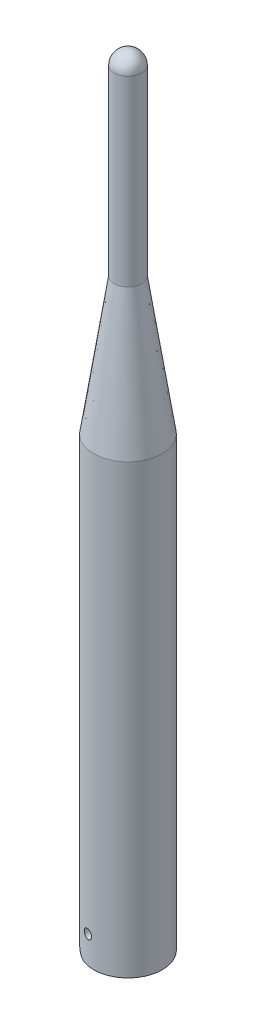
ISO-10303-21;
HEADER;
FILE_DESCRIPTION(('STEP AP214'),'2;1');
FILE_NAME('part.step','',(''),(''),'','','');
FILE_SCHEMA(('AUTOMOTIVE_DESIGN { 1 0 10303 214 1 1 1 1 }'));
ENDSEC;
DATA;
#1=APPLICATION_CONTEXT('core data for automotive mechanical design processes');
#2=APPLICATION_PROTOCOL_DEFINITION('international standard','automotive_design',2000,#1);
#3=PRODUCT_CONTEXT('',#1,'mechanical');
#4=PRODUCT('Part','Part','',(#3));
#5=PRODUCT_RELATED_PRODUCT_CATEGORY('part','',(#4));
#6=PRODUCT_DEFINITION_FORMATION('','',#4);
#7=PRODUCT_DEFINITION_CONTEXT('part definition',#1,'design');
#8=PRODUCT_DEFINITION('design','',#6,#7);
#9=PRODUCT_DEFINITION_SHAPE('','',#8);
#10=(LENGTH_UNIT() NAMED_UNIT(*) SI_UNIT(.MILLI.,.METRE.));
#11=(NAMED_UNIT(*) PLANE_ANGLE_UNIT() SI_UNIT($,.RADIAN.));
#12=(NAMED_UNIT(*) SI_UNIT($,.STERADIAN.) SOLID_ANGLE_UNIT());
#13=UNCERTAINTY_MEASURE_WITH_UNIT(LENGTH_MEASURE(1.E-05),#10,'distance_accuracy_value','');
#14=(GEOMETRIC_REPRESENTATION_CONTEXT(3) GLOBAL_UNCERTAINTY_ASSIGNED_CONTEXT((#13)) GLOBAL_UNIT_ASSIGNED_CONTEXT((#10,
#11,#12)) REPRESENTATION_CONTEXT('',''));
#15=CARTESIAN_POINT('',(0.,0.,0.));
#16=DIRECTION('',(0.,0.,1.));
#17=DIRECTION('',(1.,0.,0.));
#18=AXIS2_PLACEMENT_3D('',#15,#16,#17);
#19=CARTESIAN_POINT('',(0.,-78.,4.));
#20=DIRECTION('',(0.,0.,-1.));
#21=DIRECTION('',(-1.,0.,0.));
#22=AXIS2_PLACEMENT_3D('',#19,#20,#21);
#23=PLANE('',#22);
#24=CARTESIAN_POINT('',(-1.5,-84.,4.));
#25=DIRECTION('',(0.,0.,-1.));
#26=DIRECTION('',(-1.,0.,0.));
#27=AXIS2_PLACEMENT_3D('',#24,#25,#26);
#28=CIRCLE('',#27,1.);
#29=CARTESIAN_POINT('',(-2.5,-84.,4.));
#30=VERTEX_POINT('',#29);
#31=EDGE_CURVE('E231',#30,#30,#28,.T.);
#32=ORIENTED_EDGE('',*,*,#31,.F.);
#33=EDGE_LOOP('',(#32));
#34=FACE_BOUND('',#33,.T.);
#35=CARTESIAN_POINT('',(-2.34428877022476,-86.,4.));
#36=DIRECTION('',(0.,0.,-1.));
#37=DIRECTION('',(-1.,0.,0.));
#38=AXIS2_PLACEMENT_3D('',#35,#36,#37);
#39=CIRCLE('',#38,4.);
#40=CARTESIAN_POINT('',(-6.34428877022476,-86.,4.));
#41=VERTEX_POINT('',#40);
#42=CARTESIAN_POINT('',(-2.34428877022473,-90.,4.));
#43=VERTEX_POINT('',#42);
#44=EDGE_CURVE('E121',#41,#43,#39,.F.);
#45=ORIENTED_EDGE('',*,*,#44,.F.);
#46=DIRECTION('',(0.,-1.,0.));
#47=VECTOR('',#46,1.);
#48=CARTESIAN_POINT('',(-6.34428877022476,-78.,4.));
#49=LINE('',#48,#47);
#50=CARTESIAN_POINT('',(-6.34428877022476,-76.,4.));
#51=VERTEX_POINT('',#50);
#52=EDGE_CURVE('E142',#51,#41,#49,.T.);
#53=ORIENTED_EDGE('',*,*,#52,.F.);
#54=CARTESIAN_POINT('',(-6.34428877022476,-76.,4.));
#55=CARTESIAN_POINT('',(-6.24065150555362,-76.0876645844549,4.));
#56=CARTESIAN_POINT('',(-6.13671667269984,-76.1749762176017,4.));
#57=CARTESIAN_POINT('',(-5.9281671527139,-76.3487873336429,4.));
#58=CARTESIAN_POINT('',(-5.82355245324621,-76.4352868017314,4.));
#59=CARTESIAN_POINT('',(-5.50869527270602,-76.693297817078,4.));
#60=CARTESIAN_POINT('',(-5.29731343763854,-76.8634292191689,4.));
#61=CARTESIAN_POINT('',(-4.97728878333611,-77.1149331441965,4.));
#62=CARTESIAN_POINT('',(-4.87010542423131,-77.198164607321,4.));
#63=CARTESIAN_POINT('',(-4.65462354167118,-77.3631673822506,4.));
#64=CARTESIAN_POINT('',(-4.54632504907957,-77.4449387342971,4.));
#65=CARTESIAN_POINT('',(-4.32838915617984,-77.6068165324652,4.));
#66=CARTESIAN_POINT('',(-4.21875100971875,-77.6869219766989,4.));
#67=CARTESIAN_POINT('',(-3.99799219446533,-77.8450847860225,4.));
#68=CARTESIAN_POINT('',(-3.88687137881927,-77.9231419459305,4.));
#69=CARTESIAN_POINT('',(-3.77491721763538,-78.,4.));
#70=B_SPLINE_CURVE_WITH_KNOTS('',3,(#54,#55,#56,#57,#58,#59,#60,#61,#62,#63,#64,#65,#66,#67,#68,
#69),.UNSPECIFIED.,.F.,.F.,(4,2,2,2,2,2,2,4),(0.,0.407221710125804,0.814450829647081,
1.62841211679194,2.03551634676077,2.44260933936086,2.84994046604502,3.2573122415829),.UNSPECIFIED.);
#71=CARTESIAN_POINT('',(-3.77491721763538,-78.,4.));
#72=VERTEX_POINT('',#71);
#73=EDGE_CURVE('E61',#51,#72,#70,.T.);
#74=ORIENTED_EDGE('',*,*,#73,.T.);
#75=DIRECTION('',(1.,0.,0.));
#76=VECTOR('',#75,1.);
#77=CARTESIAN_POINT('',(0.,-78.,4.));
#78=LINE('',#77,#76);
#79=CARTESIAN_POINT('',(5.5,-78.,4.));
#80=VERTEX_POINT('',#79);
#81=EDGE_CURVE('E131',#72,#80,#78,.T.);
#82=ORIENTED_EDGE('',*,*,#81,.T.);
#83=DIRECTION('',(0.,-1.,0.));
#84=VECTOR('',#83,1.);
#85=CARTESIAN_POINT('',(5.5,-78.,4.));
#86=LINE('',#85,#84);
#87=CARTESIAN_POINT('',(5.5,-90.,4.));
#88=VERTEX_POINT('',#87);
#89=EDGE_CURVE('E133',#80,#88,#86,.T.);
#90=ORIENTED_EDGE('',*,*,#89,.T.);
#91=DIRECTION('',(1.,0.,0.));
#92=VECTOR('',#91,1.);
#93=CARTESIAN_POINT('',(0.,-90.,4.));
#94=LINE('',#93,#92);
#95=EDGE_CURVE('E236',#43,#88,#94,.T.);
#96=ORIENTED_EDGE('',*,*,#95,.F.);
#97=EDGE_LOOP('',(#45,#53,#74,#82,#90,#96));
#98=FACE_BOUND('',#97,.T.);
#99=ADVANCED_FACE('F46',(#34,#98),#23,.T.);
#100=CARTESIAN_POINT('',(0.,-78.,-4.));
#101=DIRECTION('',(0.,0.,-1.));
#102=DIRECTION('',(-1.,0.,0.));
#103=AXIS2_PLACEMENT_3D('',#100,#101,#102);
#104=PLANE('',#103);
#105=CARTESIAN_POINT('',(-1.5,-84.,-4.));
#106=DIRECTION('',(0.,0.,-1.));
#107=DIRECTION('',(-1.,0.,0.));
#108=AXIS2_PLACEMENT_3D('',#105,#106,#107);
#109=CIRCLE('',#108,1.);
#110=CARTESIAN_POINT('',(-2.5,-84.,-4.));
#111=VERTEX_POINT('',#110);
#112=EDGE_CURVE('E357',#111,#111,#109,.T.);
#113=ORIENTED_EDGE('',*,*,#112,.T.);
#114=EDGE_LOOP('',(#113));
#115=FACE_BOUND('',#114,.T.);
#116=DIRECTION('',(0.,-1.,0.));
#117=VECTOR('',#116,1.);
#118=CARTESIAN_POINT('',(-6.34428877022476,-78.,-4.));
#119=LINE('',#118,#117);
#120=CARTESIAN_POINT('',(-6.34428877022476,-76.,-4.));
#121=VERTEX_POINT('',#120);
#122=CARTESIAN_POINT('',(-6.34428877022476,-86.,-4.));
#123=VERTEX_POINT('',#122);
#124=EDGE_CURVE('E119',#121,#123,#119,.T.);
#125=ORIENTED_EDGE('',*,*,#124,.T.);
#126=CARTESIAN_POINT('',(-2.34428877022476,-86.,-4.));
#127=DIRECTION('',(0.,0.,-1.));
#128=DIRECTION('',(-1.,0.,0.));
#129=AXIS2_PLACEMENT_3D('',#126,#127,#128);
#130=CIRCLE('',#129,4.);
#131=CARTESIAN_POINT('',(-2.34428877022476,-90.,-4.));
#132=VERTEX_POINT('',#131);
#133=EDGE_CURVE('E12',#123,#132,#130,.F.);
#134=ORIENTED_EDGE('',*,*,#133,.T.);
#135=DIRECTION('',(1.,0.,0.));
#136=VECTOR('',#135,1.);
#137=CARTESIAN_POINT('',(0.,-90.,-4.));
#138=LINE('',#137,#136);
#139=CARTESIAN_POINT('',(5.5,-90.,-4.));
#140=VERTEX_POINT('',#139);
#141=EDGE_CURVE('E249',#132,#140,#138,.T.);
#142=ORIENTED_EDGE('',*,*,#141,.T.);
#143=DIRECTION('',(0.,-1.,0.));
#144=VECTOR('',#143,1.);
#145=CARTESIAN_POINT('',(5.5,-78.,-4.));
#146=LINE('',#145,#144);
#147=CARTESIAN_POINT('',(5.5,-78.,-4.));
#148=VERTEX_POINT('',#147);
#149=EDGE_CURVE('E128',#148,#140,#146,.T.);
#150=ORIENTED_EDGE('',*,*,#149,.F.);
#151=DIRECTION('',(1.,0.,0.));
#152=VECTOR('',#151,1.);
#153=CARTESIAN_POINT('',(0.,-78.,-4.));
#154=LINE('',#153,#152);
#155=CARTESIAN_POINT('',(-3.77491721763538,-78.,-4.));
#156=VERTEX_POINT('',#155);
#157=EDGE_CURVE('E243',#156,#148,#154,.T.);
#158=ORIENTED_EDGE('',*,*,#157,.F.);
#159=CARTESIAN_POINT('',(-3.77491721763538,-78.,-4.));
#160=CARTESIAN_POINT('',(-3.88687137881927,-77.9231419459305,-4.));
#161=CARTESIAN_POINT('',(-3.99799219446533,-77.8450847860225,-4.));
#162=CARTESIAN_POINT('',(-4.21875100971875,-77.6869219766989,-4.));
#163=CARTESIAN_POINT('',(-4.32838915617983,-77.6068165324652,-4.));
#164=CARTESIAN_POINT('',(-4.54632504907957,-77.4449387342971,-4.));
#165=CARTESIAN_POINT('',(-4.65462354167117,-77.3631673822506,-4.));
#166=CARTESIAN_POINT('',(-4.87010542423131,-77.198164607321,-4.));
#167=CARTESIAN_POINT('',(-4.97728878333611,-77.1149331441965,-4.));
#168=CARTESIAN_POINT('',(-5.29731343763854,-76.8634292191689,-4.));
#169=CARTESIAN_POINT('',(-5.50869527270602,-76.693297817078,-4.));
#170=CARTESIAN_POINT('',(-5.82355245324621,-76.4352868017314,-4.));
#171=CARTESIAN_POINT('',(-5.9281671527139,-76.3487873336429,-4.));
#172=CARTESIAN_POINT('',(-6.13671667269984,-76.1749762176017,-4.));
#173=CARTESIAN_POINT('',(-6.24065150555362,-76.0876645844549,-4.));
#174=CARTESIAN_POINT('',(-6.34428877022476,-76.,-4.));
#175=B_SPLINE_CURVE_WITH_KNOTS('',3,(#159,#160,#161,#162,#163,#164,#165,#166,#167,#168,#169,
#170,#171,#172,#173,#174),.UNSPECIFIED.,.F.,.F.,(4,2,2,2,2,2,2,4),(0.,0.407371775537878,
0.814702902222035,1.22179589482213,1.62890012479095,2.44286141193582,2.85009053145709,
3.2573122415829),.UNSPECIFIED.);
#176=EDGE_CURVE('E126',#156,#121,#175,.T.);
#177=ORIENTED_EDGE('',*,*,#176,.T.);
#178=EDGE_LOOP('',(#125,#134,#142,#150,#158,#177));
#179=FACE_BOUND('',#178,.T.);
#180=ADVANCED_FACE('F127',(#115,#179),#104,.F.);
#181=CARTESIAN_POINT('',(0.,81.,0.));
#182=DIRECTION('',(0.,1.,0.));
#183=DIRECTION('',(0.,0.,1.));
#184=AXIS2_PLACEMENT_3D('',#181,#182,#183);
#185=CYLINDRICAL_SURFACE('',#184,7.5);
#186=CARTESIAN_POINT('',(-0.499999999999999,-84.,-7.48331477354788));
#187=CARTESIAN_POINT('',(-0.500002294224662,-83.943974063396,-7.48331514734014));
#188=CARTESIAN_POINT('',(-0.504723612763676,-83.8879139604422,-7.48300379388825));
#189=CARTESIAN_POINT('',(-0.523488515347612,-83.7773434556476,-7.48171403967897));
#190=CARTESIAN_POINT('',(-0.537541588220618,-83.7228346901519,-7.48073495992855));
#191=CARTESIAN_POINT('',(-0.574564104874707,-83.616972090195,-7.47798226210355));
#192=CARTESIAN_POINT('',(-0.597530377165905,-83.5656171410642,-7.4762089266061));
#193=CARTESIAN_POINT('',(-0.651705465463514,-83.4675194428975,-7.47168088473047));
#194=CARTESIAN_POINT('',(-0.682912450638484,-83.4207756725648,-7.46892639628676));
#195=CARTESIAN_POINT('',(-0.752621672183066,-83.3332522082001,-7.46222365284704));
#196=CARTESIAN_POINT('',(-0.791117520739759,-83.2924673469361,-7.45827644133795));
#197=CARTESIAN_POINT('',(-0.874278680638487,-83.2179579819895,-7.44898539631068));
#198=CARTESIAN_POINT('',(-0.918944034346798,-83.184233526795,-7.44364155320154));
#199=CARTESIAN_POINT('',(-1.01309914144711,-83.1247702515083,-7.43141169607075));
#200=CARTESIAN_POINT('',(-1.06258772275765,-83.0990294976425,-7.42452605619251));
#201=CARTESIAN_POINT('',(-1.16493303721383,-83.0561735423196,-7.40915694111749));
#202=CARTESIAN_POINT('',(-1.21778983658044,-83.0390585105077,-7.40067343449938));
#203=CARTESIAN_POINT('',(-1.32577369444304,-83.0137214336976,-7.38209642520555));
#204=CARTESIAN_POINT('',(-1.38091548188131,-83.0055713047535,-7.371990637499));
#205=CARTESIAN_POINT('',(-1.49151958692298,-82.9985010440972,-7.35041123093763));
#206=CARTESIAN_POINT('',(-1.54698193891618,-82.9995819217583,-7.33893746263492));
#207=CARTESIAN_POINT('',(-1.65791439360795,-83.010941043508,-7.31468464658794));
#208=CARTESIAN_POINT('',(-1.71335951834747,-83.0214146246831,-7.30188300874597));
#209=CARTESIAN_POINT('',(-1.82157464799653,-83.0514513794144,-7.27564217356194));
#210=CARTESIAN_POINT('',(-1.87434419565762,-83.0710161008521,-7.26220286799891));
#211=CARTESIAN_POINT('',(-1.97709846425436,-83.1192747325111,-7.2349137814882));
#212=CARTESIAN_POINT('',(-2.02698324973639,-83.1481806132362,-7.22106201232799));
#213=CARTESIAN_POINT('',(-2.1211709088456,-83.2142168622807,-7.1939585245136));
#214=CARTESIAN_POINT('',(-2.16547326188895,-83.2513479967483,-7.18070686189543));
#215=CARTESIAN_POINT('',(-2.24730153271283,-83.3330011312151,-7.15552062770088));
#216=CARTESIAN_POINT('',(-2.28481332902545,-83.3775381717944,-7.14358882044391));
#217=CARTESIAN_POINT('',(-2.35172971420763,-83.4727980213948,-7.12184032166485));
#218=CARTESIAN_POINT('',(-2.38113618230035,-83.5235193926365,-7.11202313998164));
#219=CARTESIAN_POINT('',(-2.42985180931386,-83.6277597330563,-7.09552398119711));
#220=CARTESIAN_POINT('',(-2.44949224507349,-83.6811074571922,-7.08874006959283));
#221=CARTESIAN_POINT('',(-2.47948447368391,-83.7906418250084,-7.07830579464311));
#222=CARTESIAN_POINT('',(-2.48983981854332,-83.8468273743832,-7.07465423304133));
#223=CARTESIAN_POINT('',(-2.5005528195353,-83.9573526851148,-7.07087444193144));
#224=CARTESIAN_POINT('',(-2.50139394398307,-84.0116402167042,-7.07057583679983));
#225=CARTESIAN_POINT('',(-2.49429800495519,-84.1195605651142,-7.07308217538169));
#226=CARTESIAN_POINT('',(-2.48636197868213,-84.1731934585369,-7.07588675238977));
#227=CARTESIAN_POINT('',(-2.46223632051021,-84.2773234927333,-7.08431716674393));
#228=CARTESIAN_POINT('',(-2.44619453956458,-84.3278592283149,-7.08989243693944));
#229=CARTESIAN_POINT('',(-2.40649601589661,-84.4254917562853,-7.10346496629705));
#230=CARTESIAN_POINT('',(-2.38283827815411,-84.4725880983324,-7.11146254192382));
#231=CARTESIAN_POINT('',(-2.32779283203771,-84.5636280464157,-7.1296734784892));
#232=CARTESIAN_POINT('',(-2.29618640347721,-84.6074268814402,-7.13994834446277));
#233=CARTESIAN_POINT('',(-2.22657618206973,-84.6891818139507,-7.16196126909824));
#234=CARTESIAN_POINT('',(-2.18857078002029,-84.7271364371366,-7.17369969562059));
#235=CARTESIAN_POINT('',(-2.10507636140074,-84.7981452996081,-7.19865566123978));
#236=CARTESIAN_POINT('',(-2.05930505740825,-84.8308521729748,-7.21191806224143));
#237=CARTESIAN_POINT('',(-1.96299736756691,-84.8881294302874,-7.23872494081384));
#238=CARTESIAN_POINT('',(-1.91246007877278,-84.9126982684376,-7.25226947145556));
#239=CARTESIAN_POINT('',(-1.80635033103441,-84.9536656577316,-7.27943557218279));
#240=CARTESIAN_POINT('',(-1.7506727910942,-84.9697993345,-7.29304744163918));
#241=CARTESIAN_POINT('',(-1.63716023923553,-84.9922367356769,-7.3193646576276));
#242=CARTESIAN_POINT('',(-1.57932527735684,-84.9985406879334,-7.33207002516537));
#243=CARTESIAN_POINT('',(-1.46356774886237,-85.0009993509964,-7.35604769687094));
#244=CARTESIAN_POINT('',(-1.40564874128438,-84.9972260421708,-7.36732956500713));
#245=CARTESIAN_POINT('',(-1.29105326612441,-84.9796427769911,-7.38827270272527));
#246=CARTESIAN_POINT('',(-1.23437661461863,-84.9658343167645,-7.39793421361991));
#247=CARTESIAN_POINT('',(-1.1254615946641,-84.9289466959068,-7.41527494140721));
#248=CARTESIAN_POINT('',(-1.07314668498097,-84.9061143362036,-7.42299863607897));
#249=CARTESIAN_POINT('',(-0.972999787318483,-84.8517717374686,-7.43678886629274));
#250=CARTESIAN_POINT('',(-0.925167177979965,-84.8202627036334,-7.44285563175056));
#251=CARTESIAN_POINT('',(-0.836330861959564,-84.7501238855699,-7.45335614197829));
#252=CARTESIAN_POINT('',(-0.795214717578049,-84.711640697535,-7.45781871175929));
#253=CARTESIAN_POINT('',(-0.719959096940996,-84.628244073164,-7.46546002697499));
#254=CARTESIAN_POINT('',(-0.685820849902325,-84.5833295062506,-7.46863854630925));
#255=CARTESIAN_POINT('',(-0.625699846256159,-84.4886022557267,-7.47391523324346));
#256=CARTESIAN_POINT('',(-0.59967754731212,-84.4388149245537,-7.476018671928));
#257=CARTESIAN_POINT('',(-0.556337240213471,-84.3356000452033,-7.47936931450389));
#258=CARTESIAN_POINT('',(-0.539010444509423,-84.2821762342747,-7.48061738328809));
#259=CARTESIAN_POINT('',(-0.51754921297533,-84.1904208270863,-7.48212639728917));
#260=CARTESIAN_POINT('',(-0.510977518469956,-84.1526436676775,-7.48257452771826));
#261=CARTESIAN_POINT('',(-0.502202122993188,-84.0765829950463,-7.4831685884184));
#262=CARTESIAN_POINT('',(-0.499998431661859,-84.0382994807066,-7.48331451802249));
#263=CARTESIAN_POINT('',(-0.499999999999999,-84.,-7.48331477354788));
#264=B_SPLINE_CURVE_WITH_KNOTS('',3,(#186,#187,#188,#189,#190,#191,#192,#193,#194,#195,#196,
#197,#198,#199,#200,#201,#202,#203,#204,#205,#206,#207,#208,#209,#210,#211,#212,#213,#214,#215,
#216,#217,#218,#219,#220,#221,#222,#223,#224,#225,#226,#227,#228,#229,#230,#231,#232,#233,#234,
#235,#236,#237,#238,#239,#240,#241,#242,#243,#244,#245,#246,#247,#248,#249,#250,#251,#252,#253,
#254,#255,#256,#257,#258,#259,#260,#261,#262,#263),.UNSPECIFIED.,.T.,.F.,(4,2,2,2,2,2,2,2,2,2,2,
2,2,2,2,2,2,2,2,2,2,2,2,2,2,2,2,2,2,2,2,2,2,2,2,2,2,2,4),(0.,0.167938950192115,
0.336048928140746,0.50409914404694,0.67211205576056,0.839978400217488,1.0078458974777,
1.17567270287568,1.34350280885721,1.51266963796918,1.68185496502762,1.85464252646129,
2.02745951794711,2.20451156432329,2.38158010930058,2.55901275415276,2.73640422651463,
2.90727843984469,3.07808725737471,3.24017488251015,3.4022433556736,3.56145696923308,
3.72069139240253,3.88490856253923,4.04916709156871,4.22177894068744,4.39442355813834,
4.5722054889428,4.74998329879059,4.92649467066286,5.10297973208352,5.27493932115411,
5.44687503694236,5.61554547948254,5.7842456092188,5.95211047626055,6.11980535816171,
6.23460862210496,6.34941213941566),.UNSPECIFIED.);
#265=CARTESIAN_POINT('',(-0.499999999999999,-84.,-7.48331477354788));
#266=VERTEX_POINT('',#265);
#267=EDGE_CURVE('E55',#266,#266,#264,.T.);
#268=ORIENTED_EDGE('',*,*,#267,.T.);
#269=EDGE_LOOP('',(#268));
#270=FACE_BOUND('',#269,.T.);
#271=CARTESIAN_POINT('',(-0.499999999999999,-84.,7.48331477354788));
#272=CARTESIAN_POINT('',(-0.500002294224662,-84.056025936604,7.48331514734014));
#273=CARTESIAN_POINT('',(-0.504723612763676,-84.1120860395578,7.48300379388825));
#274=CARTESIAN_POINT('',(-0.523488515347612,-84.2226565443524,7.48171403967897));
#275=CARTESIAN_POINT('',(-0.537541588220618,-84.2771653098481,7.48073495992855));
#276=CARTESIAN_POINT('',(-0.574564104874705,-84.383027909805,7.47798226210355));
#277=CARTESIAN_POINT('',(-0.5975303771659,-84.4343828589358,7.4762089266061));
#278=CARTESIAN_POINT('',(-0.651705465463506,-84.5324805571025,7.47168088473047));
#279=CARTESIAN_POINT('',(-0.68291245063848,-84.5792243274352,7.46892639628676));
#280=CARTESIAN_POINT('',(-0.752621672183064,-84.6667477917999,7.46222365284704));
#281=CARTESIAN_POINT('',(-0.791117520739754,-84.7075326530639,7.45827644133795));
#282=CARTESIAN_POINT('',(-0.874278680638481,-84.7820420180105,7.44898539631068));
#283=CARTESIAN_POINT('',(-0.918944034346796,-84.815766473205,7.44364155320154));
#284=CARTESIAN_POINT('',(-1.01309914144711,-84.8752297484917,7.43141169607075));
#285=CARTESIAN_POINT('',(-1.06258772275765,-84.9009705023575,7.42452605619251));
#286=CARTESIAN_POINT('',(-1.16493303721383,-84.9438264576804,7.40915694111749));
#287=CARTESIAN_POINT('',(-1.21778983658044,-84.9609414894923,7.40067343449938));
#288=CARTESIAN_POINT('',(-1.32577369444304,-84.9862785663024,7.38209642520555));
#289=CARTESIAN_POINT('',(-1.38091548188131,-84.9944286952465,7.371990637499));
#290=CARTESIAN_POINT('',(-1.49151958692298,-85.0014989559028,7.35041123093763));
#291=CARTESIAN_POINT('',(-1.54698193891618,-85.0004180782417,7.33893746263492));
#292=CARTESIAN_POINT('',(-1.65791439360795,-84.989058956492,7.31468464658794));
#293=CARTESIAN_POINT('',(-1.71335951834747,-84.9785853753169,7.30188300874597));
#294=CARTESIAN_POINT('',(-1.82157464799653,-84.9485486205856,7.27564217356194));
#295=CARTESIAN_POINT('',(-1.87434419565762,-84.9289838991479,7.26220286799891));
#296=CARTESIAN_POINT('',(-1.97709846425436,-84.8807252674889,7.2349137814882));
#297=CARTESIAN_POINT('',(-2.02698324973639,-84.8518193867638,7.22106201232799));
#298=CARTESIAN_POINT('',(-2.1211709088456,-84.7857831377193,7.1939585245136));
#299=CARTESIAN_POINT('',(-2.16547326188895,-84.7486520032517,7.18070686189543));
#300=CARTESIAN_POINT('',(-2.24730153271283,-84.6669988687849,7.15552062770088));
#301=CARTESIAN_POINT('',(-2.28481332902545,-84.6224618282056,7.14358882044391));
#302=CARTESIAN_POINT('',(-2.35172971420763,-84.5272019786052,7.12184032166485));
#303=CARTESIAN_POINT('',(-2.38113618230035,-84.4764806073635,7.11202313998164));
#304=CARTESIAN_POINT('',(-2.42985180931386,-84.3722402669437,7.09552398119711));
#305=CARTESIAN_POINT('',(-2.44949224507349,-84.3188925428078,7.08874006959283));
#306=CARTESIAN_POINT('',(-2.47948447368391,-84.2093581749916,7.07830579464311));
#307=CARTESIAN_POINT('',(-2.48983981854332,-84.1531726256168,7.07465423304133));
#308=CARTESIAN_POINT('',(-2.5005528195353,-84.0426473148852,7.07087444193144));
#309=CARTESIAN_POINT('',(-2.50139394398307,-83.9883597832958,7.07057583679983));
#310=CARTESIAN_POINT('',(-2.49429800495519,-83.8804394348858,7.07308217538169));
#311=CARTESIAN_POINT('',(-2.48636197868213,-83.8268065414631,7.07588675238977));
#312=CARTESIAN_POINT('',(-2.46223632051021,-83.7226765072667,7.08431716674393));
#313=CARTESIAN_POINT('',(-2.44619453956458,-83.6721407716851,7.08989243693944));
#314=CARTESIAN_POINT('',(-2.40649601589661,-83.5745082437147,7.10346496629705));
#315=CARTESIAN_POINT('',(-2.38283827815411,-83.5274119016676,7.11146254192382));
#316=CARTESIAN_POINT('',(-2.32779283203771,-83.4363719535843,7.1296734784892));
#317=CARTESIAN_POINT('',(-2.29618640347721,-83.3925731185598,7.13994834446277));
#318=CARTESIAN_POINT('',(-2.22657618206973,-83.3108181860493,7.16196126909824));
#319=CARTESIAN_POINT('',(-2.18857078002029,-83.2728635628634,7.17369969562059));
#320=CARTESIAN_POINT('',(-2.10507636140074,-83.2018547003919,7.19865566123978));
#321=CARTESIAN_POINT('',(-2.05930505740825,-83.1691478270252,7.21191806224143));
#322=CARTESIAN_POINT('',(-1.96299736756691,-83.1118705697126,7.23872494081384));
#323=CARTESIAN_POINT('',(-1.91246007877278,-83.0873017315624,7.25226947145556));
#324=CARTESIAN_POINT('',(-1.80635033103441,-83.0463343422684,7.27943557218279));
#325=CARTESIAN_POINT('',(-1.7506727910942,-83.0302006655,7.29304744163918));
#326=CARTESIAN_POINT('',(-1.63716023923553,-83.0077632643231,7.3193646576276));
#327=CARTESIAN_POINT('',(-1.57932527735684,-83.0014593120666,7.33207002516537));
#328=CARTESIAN_POINT('',(-1.46356774886237,-82.9990006490036,7.35604769687094));
#329=CARTESIAN_POINT('',(-1.40564874128438,-83.0027739578292,7.36732956500713));
#330=CARTESIAN_POINT('',(-1.29105326612441,-83.0203572230089,7.38827270272527));
#331=CARTESIAN_POINT('',(-1.23437661461863,-83.0341656832355,7.39793421361991));
#332=CARTESIAN_POINT('',(-1.1254615946641,-83.0710533040932,7.41527494140721));
#333=CARTESIAN_POINT('',(-1.07314668498097,-83.0938856637964,7.42299863607897));
#334=CARTESIAN_POINT('',(-0.972999787318479,-83.1482282625315,7.43678886629274));
#335=CARTESIAN_POINT('',(-0.925167177979963,-83.1797372963666,7.44285563175056));
#336=CARTESIAN_POINT('',(-0.836330861959562,-83.2498761144301,7.45335614197829));
#337=CARTESIAN_POINT('',(-0.795214717578045,-83.288359302465,7.45781871175929));
#338=CARTESIAN_POINT('',(-0.719959096940993,-83.3717559268361,7.46546002697499));
#339=CARTESIAN_POINT('',(-0.685820849902323,-83.4166704937494,7.46863854630925));
#340=CARTESIAN_POINT('',(-0.625699846256159,-83.5113977442733,7.47391523324346));
#341=CARTESIAN_POINT('',(-0.59967754731212,-83.5611850754463,7.476018671928));
#342=CARTESIAN_POINT('',(-0.556337240213471,-83.6643999547967,7.47936931450389));
#343=CARTESIAN_POINT('',(-0.539010444509423,-83.7178237657253,7.48061738328809));
#344=CARTESIAN_POINT('',(-0.51754921297533,-83.8095791729137,7.48212639728917));
#345=CARTESIAN_POINT('',(-0.510977518469956,-83.8473563323225,7.48257452771826));
#346=CARTESIAN_POINT('',(-0.502202122993188,-83.9234170049537,7.4831685884184));
#347=CARTESIAN_POINT('',(-0.499998431661859,-83.9617005192934,7.48331451802249));
#348=CARTESIAN_POINT('',(-0.499999999999999,-84.,7.48331477354788));
#349=B_SPLINE_CURVE_WITH_KNOTS('',3,(#271,#272,#273,#274,#275,#276,#277,#278,#279,#280,#281,
#282,#283,#284,#285,#286,#287,#288,#289,#290,#291,#292,#293,#294,#295,#296,#297,#298,#299,#300,
#301,#302,#303,#304,#305,#306,#307,#308,#309,#310,#311,#312,#313,#314,#315,#316,#317,#318,#319,
#320,#321,#322,#323,#324,#325,#326,#327,#328,#329,#330,#331,#332,#333,#334,#335,#336,#337,#338,
#339,#340,#341,#342,#343,#344,#345,#346,#347,#348),.UNSPECIFIED.,.T.,.F.,(4,2,2,2,2,2,2,2,2,2,2,
2,2,2,2,2,2,2,2,2,2,2,2,2,2,2,2,2,2,2,2,2,2,2,2,2,2,2,4),(0.,0.167938950192115,
0.336048928140746,0.50409914404691,0.672112055760559,0.839978400217483,1.0078458974777,
1.17567270287568,1.34350280885721,1.51266963796918,1.68185496502762,1.85464252646129,
2.02745951794711,2.20451156432329,2.38158010930058,2.55901275415276,2.73640422651463,
2.90727843984469,3.07808725737471,3.24017488251015,3.4022433556736,3.56145696923308,
3.72069139240253,3.88490856253924,4.04916709156871,4.22177894068744,4.39442355813834,
4.5722054889428,4.74998329879059,4.92649467066286,5.10297973208352,5.27493932115412,
5.44687503694236,5.61554547948256,5.7842456092188,5.95211047626054,6.11980535816171,
6.23460862210496,6.34941213941565),.UNSPECIFIED.);
#350=CARTESIAN_POINT('',(-0.499999999999999,-84.,7.48331477354788));
#351=VERTEX_POINT('',#350);
#352=EDGE_CURVE('E210',#351,#351,#349,.T.);
#353=ORIENTED_EDGE('',*,*,#352,.T.);
#354=EDGE_LOOP('',(#353));
#355=FACE_BOUND('',#354,.T.);
#356=CARTESIAN_POINT('',(0.,-90.,0.));
#357=DIRECTION('',(0.,-1.,0.));
#358=DIRECTION('',(0.,0.,-1.));
#359=AXIS2_PLACEMENT_3D('',#356,#357,#358);
#360=CIRCLE('',#359,7.5);
#361=CARTESIAN_POINT('',(-2.34428877022473,-90.,-7.12420593201784));
#362=VERTEX_POINT('',#361);
#363=CARTESIAN_POINT('',(-2.34428877022473,-90.,7.12420593201784));
#364=VERTEX_POINT('',#363);
#365=EDGE_CURVE('E124',#362,#364,#360,.T.);
#366=ORIENTED_EDGE('',*,*,#365,.F.);
#367=CARTESIAN_POINT('',(-2.34428877022473,-90.,-7.12420593201784));
#368=CARTESIAN_POINT('',(-2.46106759006975,-90.0000146348701,-7.08580609904446));
#369=CARTESIAN_POINT('',(-2.5768312891128,-89.9948876868402,-7.04450479145868));
#370=CARTESIAN_POINT('',(-2.80535350297101,-89.9749874116234,-6.9566411303202));
#371=CARTESIAN_POINT('',(-2.91811530862086,-89.9602251421411,-6.91008485807216));
#372=CARTESIAN_POINT('',(-3.13905926107248,-89.9218394839445,-6.81254742221008));
#373=CARTESIAN_POINT('',(-3.24727041800313,-89.8982865921268,-6.76160387845657));
#374=CARTESIAN_POINT('',(-3.45946345402262,-89.8429694446323,-6.6555389164185));
#375=CARTESIAN_POINT('',(-3.56344416216651,-89.811202933166,-6.60041635335158));
#376=CARTESIAN_POINT('',(-3.86734117398362,-89.7048887477577,-6.43018665026562));
#377=CARTESIAN_POINT('',(-4.06041311246634,-89.6191054601973,-6.30967977237765));
#378=CARTESIAN_POINT('',(-4.42633167027209,-89.4217699379183,-6.05863311980223));
#379=CARTESIAN_POINT('',(-4.5991229915629,-89.3101496068682,-5.92806745168505));
#380=CARTESIAN_POINT('',(-4.85674584920508,-89.1147939791352,-5.71641148517907));
#381=CARTESIAN_POINT('',(-4.94861070299817,-89.0383702036058,-5.63696719121065));
#382=CARTESIAN_POINT('',(-5.12482048581834,-88.8779927997978,-5.47725721182359));
#383=CARTESIAN_POINT('',(-5.20916379651761,-88.7940375588137,-5.39699135375954));
#384=CARTESIAN_POINT('',(-5.37017056108043,-88.6188160434255,-5.23680780521239));
#385=CARTESIAN_POINT('',(-5.44683609955122,-88.5275517656901,-5.15689002588927));
#386=CARTESIAN_POINT('',(-5.59231128545996,-88.3376576502326,-4.99875988027407));
#387=CARTESIAN_POINT('',(-5.66112358195152,-88.2390303148955,-4.92054694614905));
#388=CARTESIAN_POINT('',(-5.8149946373851,-87.9955187044537,-4.73865054610749));
#389=CARTESIAN_POINT('',(-5.89643146559762,-87.8471870827895,-4.63644965231296));
#390=CARTESIAN_POINT('',(-6.04220564022794,-87.5346225618433,-4.44479168575589));
#391=CARTESIAN_POINT('',(-6.10656787562792,-87.3704132889037,-4.35531615302982));
#392=CARTESIAN_POINT('',(-6.19943625923073,-87.0744810268354,-4.22156892557448));
#393=CARTESIAN_POINT('',(-6.23293252951056,-86.9469078509151,-4.17168857314846));
#394=CARTESIAN_POINT('',(-6.28762428489104,-86.6840739548144,-4.08879911108787));
#395=CARTESIAN_POINT('',(-6.30886560651032,-86.5488439858125,-4.05572718982333));
#396=CARTESIAN_POINT('',(-6.33008670883028,-86.3435958921802,-4.02245786609038));
#397=CARTESIAN_POINT('',(-6.33538555697409,-86.2753863353348,-4.01409527371144));
#398=CARTESIAN_POINT('',(-6.34249729615685,-86.1381360493675,-4.00284218412773));
#399=CARTESIAN_POINT('',(-6.34429976894013,-86.0690934511284,-3.99996804141735));
#400=CARTESIAN_POINT('',(-6.34428877022476,-86.,-4.));
#401=B_SPLINE_CURVE_WITH_KNOTS('',3,(#367,#368,#369,#370,#371,#372,#373,#374,#375,#376,#377,
#378,#379,#380,#381,#382,#383,#384,#385,#386,#387,#388,#389,#390,#391,#392,#393,#394,#395,#396,
#397,#398,#399,#400),.UNSPECIFIED.,.F.,.F.,(4,2,2,2,2,2,2,2,2,2,2,2,2,2,2,2,4),(0.,
0.36856012881598,0.736698031942323,1.10194494229475,1.46729227085611,2.19403120298948,
2.92270779418463,3.35284454711091,3.7830736256656,4.21318557335308,4.64315200425904,
5.23481237536981,5.82560550704466,6.24734309972193,6.66749288957991,6.873984466442,
7.0810903930316),.UNSPECIFIED.);
#402=EDGE_CURVE('E112',#362,#123,#401,.T.);
#403=ORIENTED_EDGE('',*,*,#402,.T.);
#404=ORIENTED_EDGE('',*,*,#124,.F.);
#405=CARTESIAN_POINT('',(0.,-76.,0.));
#406=DIRECTION('',(0.,-1.,0.));
#407=DIRECTION('',(0.,0.,-1.));
#408=AXIS2_PLACEMENT_3D('',#405,#406,#407);
#409=CIRCLE('',#408,7.5);
#410=EDGE_CURVE('E152',#121,#51,#409,.F.);
#411=ORIENTED_EDGE('',*,*,#410,.T.);
#412=ORIENTED_EDGE('',*,*,#52,.T.);
#413=CARTESIAN_POINT('',(-6.34428877022476,-86.,4.));
#414=CARTESIAN_POINT('',(-6.34430390708222,-86.0675508654178,3.99996092323469));
#415=CARTESIAN_POINT('',(-6.34257820742386,-86.1350768338476,4.00271290520114));
#416=CARTESIAN_POINT('',(-6.33576622828858,-86.2694291323412,4.01349456882781));
#417=CARTESIAN_POINT('',(-6.33068538728837,-86.3362564171475,4.02151570939816));
#418=CARTESIAN_POINT('',(-6.31737712915583,-86.4678577043093,4.04238625618256));
#419=CARTESIAN_POINT('',(-6.30919466367154,-86.5326473490834,4.05516664242841));
#420=CARTESIAN_POINT('',(-6.28986639156625,-86.660772345558,4.0850827734462));
#421=CARTESIAN_POINT('',(-6.27871920542837,-86.7241070052955,4.10222054559356));
#422=CARTESIAN_POINT('',(-6.23244719272014,-86.9547873127428,4.17257112034006));
#423=CARTESIAN_POINT('',(-6.18866112170777,-87.1168327777663,4.23776607046621));
#424=CARTESIAN_POINT('',(-6.08448136994367,-87.427647165749,4.3860366442324));
#425=CARTESIAN_POINT('',(-6.02396926006973,-87.5763109977819,4.4692388210095));
#426=CARTESIAN_POINT('',(-5.90188131266853,-87.8329160296735,4.62881177865766));
#427=CARTESIAN_POINT('',(-5.84276733412823,-87.9431773816638,4.70339918694011));
#428=CARTESIAN_POINT('',(-5.71597936838965,-88.1556975513592,4.85669363130208));
#429=CARTESIAN_POINT('',(-5.64830044761652,-88.2579517013641,4.93540302628638));
#430=CARTESIAN_POINT('',(-5.50477178661951,-88.4548296802289,5.09499974496041));
#431=CARTESIAN_POINT('',(-5.42891742066818,-88.5494491358204,5.1758882820068));
#432=CARTESIAN_POINT('',(-5.26929421824386,-88.7311093577798,5.33830534995369));
#433=CARTESIAN_POINT('',(-5.18552685934227,-88.8181515332225,5.41983375877598));
#434=CARTESIAN_POINT('',(-5.0063995573311,-88.9881535007318,5.58583126261259));
#435=CARTESIAN_POINT('',(-4.91069556377062,-89.0707756061933,5.67027563717415));
#436=CARTESIAN_POINT('',(-4.7108991328449,-89.2272670849519,5.83732687138795));
#437=CARTESIAN_POINT('',(-4.60680748547777,-89.3011372809397,5.91993390315886));
#438=CARTESIAN_POINT('',(-4.39077607562765,-89.439223789641,6.08187805670125));
#439=CARTESIAN_POINT('',(-4.27886717374702,-89.5034752301611,6.16122626864623));
#440=CARTESIAN_POINT('',(-4.04711483297663,-89.6217818704282,6.31587369989589));
#441=CARTESIAN_POINT('',(-3.92727195866319,-89.6758377946303,6.39117320661427));
#442=CARTESIAN_POINT('',(-3.69296910365531,-89.7676519871818,6.52904926150119));
#443=CARTESIAN_POINT('',(-3.57924455497558,-89.8065202924478,6.59213470327037));
#444=CARTESIAN_POINT('',(-3.34637180392085,-89.8743427665508,6.71334680048806));
#445=CARTESIAN_POINT('',(-3.22722611993726,-89.9033014866771,6.77147572313882));
#446=CARTESIAN_POINT('',(-2.98298887971142,-89.9506542399395,6.88257973327578));
#447=CARTESIAN_POINT('',(-2.85784970921802,-89.9689395109359,6.93549734514578));
#448=CARTESIAN_POINT('',(-2.60366853475679,-89.9936331201363,7.03489345333213));
#449=CARTESIAN_POINT('',(-2.47462039527468,-90.0000216866168,7.0813611117781));
#450=CARTESIAN_POINT('',(-2.34428877022473,-90.,7.12420593201784));
#451=B_SPLINE_CURVE_WITH_KNOTS('',3,(#413,#414,#415,#416,#417,#418,#419,#420,#421,#422,#423,
#424,#425,#426,#427,#428,#429,#430,#431,#432,#433,#434,#435,#436,#437,#438,#439,#440,#441,#442,
#443,#444,#445,#446,#447,#448,#449,#450),.UNSPECIFIED.,.F.,.F.,(4,2,2,2,2,2,2,2,2,2,2,2,2,2,2,2,
2,2,4),(0.,0.202534460292649,0.404741427960178,0.604123416841765,0.803598343146389,
1.34052743587538,1.88136020550394,2.31775592676233,2.7544041745373,3.19130079116673,
3.62811598794919,4.08375963390697,4.53936041474053,4.99325446776568,5.44711625662998,
5.85379889541931,6.26029450090498,6.67086306502975,7.08211336654679),.UNSPECIFIED.);
#452=EDGE_CURVE('E66',#41,#364,#451,.T.);
#453=ORIENTED_EDGE('',*,*,#452,.T.);
#454=EDGE_LOOP('',(#366,#403,#404,#411,#412,#453));
#455=FACE_BOUND('',#454,.T.);
#456=CARTESIAN_POINT('',(0.,8.00000000000001,0.));
#457=DIRECTION('',(0.,1.,0.));
#458=DIRECTION('',(0.,0.,1.));
#459=AXIS2_PLACEMENT_3D('',#456,#457,#458);
#460=CIRCLE('',#459,7.5);
#461=CARTESIAN_POINT('',(0.,8.00000000000001,7.5));
#462=VERTEX_POINT('',#461);
#463=EDGE_CURVE('E146',#462,#462,#460,.T.);
#464=ORIENTED_EDGE('',*,*,#463,.F.);
#465=EDGE_LOOP('',(#464));
#466=FACE_BOUND('',#465,.T.);
#467=ADVANCED_FACE('F120',(#270,#355,#455,#466),#185,.T.);
#468=CARTESIAN_POINT('',(0.,8.00000000000001,0.));
#469=DIRECTION('',(0.,-1.,0.));
#470=DIRECTION('',(0.,0.,-1.));
#471=AXIS2_PLACEMENT_3D('',#468,#469,#470);
#472=CONICAL_SURFACE('',#471,7.5,0.148889947609497);
#473=CARTESIAN_POINT('',(0.,38.,0.));
#474=DIRECTION('',(0.,1.,0.));
#475=DIRECTION('',(0.,0.,1.));
#476=AXIS2_PLACEMENT_3D('',#473,#474,#475);
#477=CIRCLE('',#476,3.);
#478=CARTESIAN_POINT('',(0.,38.,3.));
#479=VERTEX_POINT('',#478);
#480=EDGE_CURVE('E144',#479,#479,#477,.T.);
#481=ORIENTED_EDGE('',*,*,#480,.F.);
#482=EDGE_LOOP('',(#481));
#483=FACE_BOUND('',#482,.T.);
#484=ORIENTED_EDGE('',*,*,#463,.T.);
#485=EDGE_LOOP('',(#484));
#486=FACE_BOUND('',#485,.T.);
#487=ADVANCED_FACE('F184',(#483,#486),#472,.T.);
#488=CARTESIAN_POINT('',(0.,81.,0.));
#489=DIRECTION('',(0.,1.,0.));
#490=DIRECTION('',(0.,0.,1.));
#491=AXIS2_PLACEMENT_3D('',#488,#489,#490);
#492=CYLINDRICAL_SURFACE('',#491,3.);
#493=CARTESIAN_POINT('',(0.,78.,0.));
#494=DIRECTION('',(0.,1.,0.));
#495=DIRECTION('',(0.,0.,1.));
#496=AXIS2_PLACEMENT_3D('',#493,#494,#495);
#497=CIRCLE('',#496,3.);
#498=CARTESIAN_POINT('',(0.,78.,3.));
#499=VERTEX_POINT('',#498);
#500=EDGE_CURVE('E143',#499,#499,#497,.T.);
#501=ORIENTED_EDGE('',*,*,#500,.F.);
#502=EDGE_LOOP('',(#501));
#503=FACE_BOUND('',#502,.T.);
#504=ORIENTED_EDGE('',*,*,#480,.T.);
#505=EDGE_LOOP('',(#504));
#506=FACE_BOUND('',#505,.T.);
#507=ADVANCED_FACE('F178',(#503,#506),#492,.T.);
#508=CARTESIAN_POINT('',(0.,78.,0.));
#509=DIRECTION('',(0.,1.,0.));
#510=DIRECTION('',(1.,0.,0.));
#511=AXIS2_PLACEMENT_3D('',#508,#509,#510);
#512=SPHERICAL_SURFACE('',#511,3.);
#513=ORIENTED_EDGE('',*,*,#500,.T.);
#514=EDGE_LOOP('',(#513));
#515=FACE_BOUND('',#514,.T.);
#516=ADVANCED_FACE('F177',(#515),#512,.T.);
#517=CARTESIAN_POINT('',(0.,-90.,0.));
#518=DIRECTION('',(0.,-1.,0.));
#519=DIRECTION('',(0.,0.,-1.));
#520=AXIS2_PLACEMENT_3D('',#517,#518,#519);
#521=PLANE('',#520);
#522=DIRECTION('',(0.,0.,1.));
#523=VECTOR('',#522,1.);
#524=CARTESIAN_POINT('',(-2.34428877022473,-90.,-7.5));
#525=LINE('',#524,#523);
#526=EDGE_CURVE('E80',#362,#132,#525,.T.);
#527=ORIENTED_EDGE('',*,*,#526,.F.);
#528=ORIENTED_EDGE('',*,*,#365,.T.);
#529=EDGE_CURVE('E354',#43,#364,#525,.T.);
#530=ORIENTED_EDGE('',*,*,#529,.F.);
#531=ORIENTED_EDGE('',*,*,#95,.T.);
#532=DIRECTION('',(0.,0.,1.));
#533=VECTOR('',#532,1.);
#534=CARTESIAN_POINT('',(5.5,-90.,0.));
#535=LINE('',#534,#533);
#536=EDGE_CURVE('E244',#140,#88,#535,.T.);
#537=ORIENTED_EDGE('',*,*,#536,.F.);
#538=ORIENTED_EDGE('',*,*,#141,.F.);
#539=EDGE_LOOP('',(#527,#528,#530,#531,#537,#538));
#540=FACE_BOUND('',#539,.T.);
#541=ADVANCED_FACE('F172',(#540),#521,.T.);
#542=CARTESIAN_POINT('',(5.5,-78.,0.));
#543=DIRECTION('',(1.,0.,0.));
#544=DIRECTION('',(0.,0.,-1.));
#545=AXIS2_PLACEMENT_3D('',#542,#543,#544);
#546=PLANE('',#545);
#547=ORIENTED_EDGE('',*,*,#536,.T.);
#548=ORIENTED_EDGE('',*,*,#89,.F.);
#549=DIRECTION('',(0.,0.,1.));
#550=VECTOR('',#549,1.);
#551=CARTESIAN_POINT('',(5.5,-78.,0.));
#552=LINE('',#551,#550);
#553=EDGE_CURVE('E137',#148,#80,#552,.T.);
#554=ORIENTED_EDGE('',*,*,#553,.F.);
#555=ORIENTED_EDGE('',*,*,#149,.T.);
#556=EDGE_LOOP('',(#547,#548,#554,#555));
#557=FACE_BOUND('',#556,.T.);
#558=ADVANCED_FACE('F175',(#557),#546,.F.);
#559=CARTESIAN_POINT('',(0.,-78.,0.));
#560=DIRECTION('',(0.,-1.,0.));
#561=DIRECTION('',(0.,0.,-1.));
#562=AXIS2_PLACEMENT_3D('',#559,#560,#561);
#563=PLANE('',#562);
#564=ORIENTED_EDGE('',*,*,#81,.F.);
#565=CARTESIAN_POINT('',(0.,-78.,0.));
#566=DIRECTION('',(0.,-1.,0.));
#567=DIRECTION('',(0.,0.,-1.));
#568=AXIS2_PLACEMENT_3D('',#565,#566,#567);
#569=CIRCLE('',#568,5.5);
#570=EDGE_CURVE('E151',#72,#156,#569,.T.);
#571=ORIENTED_EDGE('',*,*,#570,.T.);
#572=ORIENTED_EDGE('',*,*,#157,.T.);
#573=ORIENTED_EDGE('',*,*,#553,.T.);
#574=EDGE_LOOP('',(#564,#571,#572,#573));
#575=FACE_BOUND('',#574,.T.);
#576=ADVANCED_FACE('F225',(#575),#563,.T.);
#577=CARTESIAN_POINT('',(0.,-78.,0.));
#578=DIRECTION('',(0.,1.,0.));
#579=DIRECTION('',(0.,0.,1.));
#580=AXIS2_PLACEMENT_3D('',#577,#578,#579);
#581=CONICAL_SURFACE('',#580,5.5,0.785398163397447);
#582=ORIENTED_EDGE('',*,*,#73,.F.);
#583=ORIENTED_EDGE('',*,*,#410,.F.);
#584=ORIENTED_EDGE('',*,*,#176,.F.);
#585=ORIENTED_EDGE('',*,*,#570,.F.);
#586=EDGE_LOOP('',(#582,#583,#584,#585));
#587=FACE_BOUND('',#586,.T.);
#588=ADVANCED_FACE('F47',(#587),#581,.T.);
#589=CARTESIAN_POINT('',(-2.34428877022476,-86.,-7.5));
#590=DIRECTION('',(0.,0.,1.));
#591=DIRECTION('',(1.,0.,0.));
#592=AXIS2_PLACEMENT_3D('',#589,#590,#591);
#593=CYLINDRICAL_SURFACE('',#592,4.);
#594=ORIENTED_EDGE('',*,*,#526,.T.);
#595=ORIENTED_EDGE('',*,*,#133,.F.);
#596=ORIENTED_EDGE('',*,*,#402,.F.);
#597=EDGE_LOOP('',(#594,#595,#596));
#598=FACE_BOUND('',#597,.T.);
#599=ADVANCED_FACE('F109',(#598),#593,.T.);
#600=ORIENTED_EDGE('',*,*,#44,.T.);
#601=ORIENTED_EDGE('',*,*,#529,.T.);
#602=ORIENTED_EDGE('',*,*,#452,.F.);
#603=EDGE_LOOP('',(#600,#601,#602));
#604=FACE_BOUND('',#603,.T.);
#605=ADVANCED_FACE('F220',(#604),#593,.T.);
#606=CARTESIAN_POINT('',(-1.5,-84.,-7.5));
#607=DIRECTION('',(0.,0.,1.));
#608=DIRECTION('',(1.,0.,0.));
#609=AXIS2_PLACEMENT_3D('',#606,#607,#608);
#610=CYLINDRICAL_SURFACE('',#609,1.);
#611=ORIENTED_EDGE('',*,*,#31,.T.);
#612=EDGE_LOOP('',(#611));
#613=FACE_BOUND('',#612,.T.);
#614=ORIENTED_EDGE('',*,*,#352,.F.);
#615=EDGE_LOOP('',(#614));
#616=FACE_BOUND('',#615,.T.);
#617=ADVANCED_FACE('F214',(#613,#616),#610,.F.);
#618=ORIENTED_EDGE('',*,*,#267,.F.);
#619=EDGE_LOOP('',(#618));
#620=FACE_BOUND('',#619,.T.);
#621=ORIENTED_EDGE('',*,*,#112,.F.);
#622=EDGE_LOOP('',(#621));
#623=FACE_BOUND('',#622,.T.);
#624=ADVANCED_FACE('F215',(#620,#623),#610,.F.);
#625=CLOSED_SHELL('',(#99,#180,#467,#487,#507,#516,#541,#558,#576,#588,#599,#605,#617,#624));
#626=MANIFOLD_SOLID_BREP('B2',#625);
#627=ADVANCED_BREP_SHAPE_REPRESENTATION('',(#18,#626),#14);
#628=SHAPE_DEFINITION_REPRESENTATION(#9,#627);
ENDSEC;
END-ISO-10303-21;
